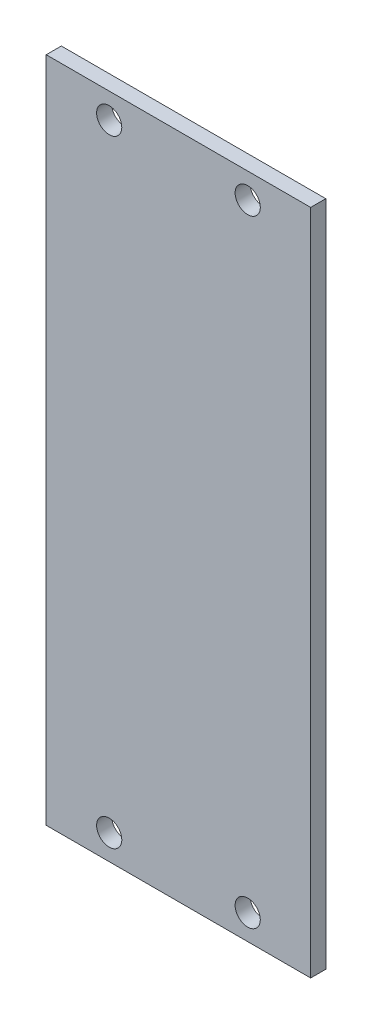
ISO-10303-21;
HEADER;
FILE_DESCRIPTION(('STEP AP214'),'2;1');
FILE_NAME('part.step','',(''),(''),'','','');
FILE_SCHEMA(('AUTOMOTIVE_DESIGN { 1 0 10303 214 1 1 1 1 }'));
ENDSEC;
DATA;
#1=APPLICATION_CONTEXT('core data for automotive mechanical design processes');
#2=APPLICATION_PROTOCOL_DEFINITION('international standard','automotive_design',2000,#1);
#3=PRODUCT_CONTEXT('',#1,'mechanical');
#4=PRODUCT('Part','Part','',(#3));
#5=PRODUCT_RELATED_PRODUCT_CATEGORY('part','',(#4));
#6=PRODUCT_DEFINITION_FORMATION('','',#4);
#7=PRODUCT_DEFINITION_CONTEXT('part definition',#1,'design');
#8=PRODUCT_DEFINITION('design','',#6,#7);
#9=PRODUCT_DEFINITION_SHAPE('','',#8);
#10=(LENGTH_UNIT() NAMED_UNIT(*) SI_UNIT(.MILLI.,.METRE.));
#11=(NAMED_UNIT(*) PLANE_ANGLE_UNIT() SI_UNIT($,.RADIAN.));
#12=(NAMED_UNIT(*) SI_UNIT($,.STERADIAN.) SOLID_ANGLE_UNIT());
#13=UNCERTAINTY_MEASURE_WITH_UNIT(LENGTH_MEASURE(1.E-05),#10,'distance_accuracy_value','');
#14=(GEOMETRIC_REPRESENTATION_CONTEXT(3) GLOBAL_UNCERTAINTY_ASSIGNED_CONTEXT((#13)) GLOBAL_UNIT_ASSIGNED_CONTEXT((#10,
#11,#12)) REPRESENTATION_CONTEXT('',''));
#15=CARTESIAN_POINT('',(0.,0.,0.));
#16=DIRECTION('',(0.,0.,1.));
#17=DIRECTION('',(1.,0.,0.));
#18=AXIS2_PLACEMENT_3D('',#15,#16,#17);
#19=CARTESIAN_POINT('',(0.,0.,1.2));
#20=DIRECTION('',(0.,0.,1.));
#21=DIRECTION('',(1.,0.,0.));
#22=AXIS2_PLACEMENT_3D('',#19,#20,#21);
#23=PLANE('',#22);
#24=CARTESIAN_POINT('',(5.49999999999983,24.5,1.2));
#25=DIRECTION('',(0.,0.,1.));
#26=DIRECTION('',(-1.,0.,0.));
#27=AXIS2_PLACEMENT_3D('',#24,#25,#26);
#28=CIRCLE('',#27,1.);
#29=CARTESIAN_POINT('',(4.49999999999983,24.5,1.2));
#30=VERTEX_POINT('',#29);
#31=EDGE_CURVE('E142',#30,#30,#28,.T.);
#32=ORIENTED_EDGE('',*,*,#31,.F.);
#33=EDGE_LOOP('',(#32));
#34=FACE_BOUND('',#33,.T.);
#35=CARTESIAN_POINT('',(-5.5,24.5,1.2));
#36=DIRECTION('',(0.,0.,1.));
#37=DIRECTION('',(1.,0.,0.));
#38=AXIS2_PLACEMENT_3D('',#35,#36,#37);
#39=CIRCLE('',#38,1.);
#40=CARTESIAN_POINT('',(-4.5,24.5,1.2));
#41=VERTEX_POINT('',#40);
#42=EDGE_CURVE('E112',#41,#41,#39,.T.);
#43=ORIENTED_EDGE('',*,*,#42,.F.);
#44=EDGE_LOOP('',(#43));
#45=FACE_BOUND('',#44,.T.);
#46=DIRECTION('',(0.,-1.,0.));
#47=VECTOR('',#46,1.);
#48=CARTESIAN_POINT('',(-10.5,-26.5,1.2));
#49=LINE('',#48,#47);
#50=CARTESIAN_POINT('',(-10.5,26.5,1.2));
#51=VERTEX_POINT('',#50);
#52=CARTESIAN_POINT('',(-10.5,-26.5,1.2));
#53=VERTEX_POINT('',#52);
#54=EDGE_CURVE('E92',#51,#53,#49,.T.);
#55=ORIENTED_EDGE('',*,*,#54,.T.);
#56=DIRECTION('',(1.,0.,0.));
#57=VECTOR('',#56,1.);
#58=CARTESIAN_POINT('',(10.5,-26.5,1.2));
#59=LINE('',#58,#57);
#60=CARTESIAN_POINT('',(10.5,-26.5,1.2));
#61=VERTEX_POINT('',#60);
#62=EDGE_CURVE('E87',#53,#61,#59,.T.);
#63=ORIENTED_EDGE('',*,*,#62,.T.);
#64=DIRECTION('',(0.,1.,0.));
#65=VECTOR('',#64,1.);
#66=CARTESIAN_POINT('',(10.5,-26.5,1.2));
#67=LINE('',#66,#65);
#68=CARTESIAN_POINT('',(10.5,26.5,1.2));
#69=VERTEX_POINT('',#68);
#70=EDGE_CURVE('E90',#61,#69,#67,.T.);
#71=ORIENTED_EDGE('',*,*,#70,.T.);
#72=DIRECTION('',(-1.,0.,0.));
#73=VECTOR('',#72,1.);
#74=CARTESIAN_POINT('',(10.5,26.5,1.2));
#75=LINE('',#74,#73);
#76=EDGE_CURVE('E57',#69,#51,#75,.T.);
#77=ORIENTED_EDGE('',*,*,#76,.T.);
#78=EDGE_LOOP('',(#55,#63,#71,#77));
#79=FACE_BOUND('',#78,.T.);
#80=CARTESIAN_POINT('',(5.49999999999983,-24.5,1.2));
#81=DIRECTION('',(0.,0.,1.));
#82=DIRECTION('',(1.,0.,0.));
#83=AXIS2_PLACEMENT_3D('',#80,#81,#82);
#84=CIRCLE('',#83,1.);
#85=CARTESIAN_POINT('',(6.49999999999983,-24.5,1.2));
#86=VERTEX_POINT('',#85);
#87=EDGE_CURVE('E134',#86,#86,#84,.T.);
#88=ORIENTED_EDGE('',*,*,#87,.F.);
#89=EDGE_LOOP('',(#88));
#90=FACE_BOUND('',#89,.T.);
#91=CARTESIAN_POINT('',(-5.5,-24.5,1.2));
#92=DIRECTION('',(0.,0.,1.));
#93=DIRECTION('',(-1.,0.,0.));
#94=AXIS2_PLACEMENT_3D('',#91,#92,#93);
#95=CIRCLE('',#94,1.);
#96=CARTESIAN_POINT('',(-6.5,-24.5,1.2));
#97=VERTEX_POINT('',#96);
#98=EDGE_CURVE('E150',#97,#97,#95,.T.);
#99=ORIENTED_EDGE('',*,*,#98,.F.);
#100=EDGE_LOOP('',(#99));
#101=FACE_BOUND('',#100,.T.);
#102=ADVANCED_FACE('F39',(#34,#45,#79,#90,#101),#23,.T.);
#103=CARTESIAN_POINT('',(0.,0.,0.));
#104=DIRECTION('',(0.,0.,1.));
#105=DIRECTION('',(1.,0.,0.));
#106=AXIS2_PLACEMENT_3D('',#103,#104,#105);
#107=PLANE('',#106);
#108=DIRECTION('',(0.,-1.,0.));
#109=VECTOR('',#108,1.);
#110=CARTESIAN_POINT('',(-10.5,-26.5,0.));
#111=LINE('',#110,#109);
#112=CARTESIAN_POINT('',(-10.5,26.5,0.));
#113=VERTEX_POINT('',#112);
#114=CARTESIAN_POINT('',(-10.5,-26.5,0.));
#115=VERTEX_POINT('',#114);
#116=EDGE_CURVE('E108',#113,#115,#111,.T.);
#117=ORIENTED_EDGE('',*,*,#116,.F.);
#118=DIRECTION('',(-1.,0.,0.));
#119=VECTOR('',#118,1.);
#120=CARTESIAN_POINT('',(10.5,26.5,0.));
#121=LINE('',#120,#119);
#122=CARTESIAN_POINT('',(10.5,26.5,0.));
#123=VERTEX_POINT('',#122);
#124=EDGE_CURVE('E80',#123,#113,#121,.T.);
#125=ORIENTED_EDGE('',*,*,#124,.F.);
#126=DIRECTION('',(0.,1.,0.));
#127=VECTOR('',#126,1.);
#128=CARTESIAN_POINT('',(10.5,-26.5,0.));
#129=LINE('',#128,#127);
#130=CARTESIAN_POINT('',(10.5,-26.5,0.));
#131=VERTEX_POINT('',#130);
#132=EDGE_CURVE('E74',#131,#123,#129,.T.);
#133=ORIENTED_EDGE('',*,*,#132,.F.);
#134=DIRECTION('',(1.,0.,0.));
#135=VECTOR('',#134,1.);
#136=CARTESIAN_POINT('',(10.5,-26.5,0.));
#137=LINE('',#136,#135);
#138=EDGE_CURVE('E97',#115,#131,#137,.T.);
#139=ORIENTED_EDGE('',*,*,#138,.F.);
#140=EDGE_LOOP('',(#117,#125,#133,#139));
#141=FACE_BOUND('',#140,.T.);
#142=CARTESIAN_POINT('',(-5.5,24.5,0.));
#143=DIRECTION('',(0.,0.,1.));
#144=DIRECTION('',(1.,0.,0.));
#145=AXIS2_PLACEMENT_3D('',#142,#143,#144);
#146=CIRCLE('',#145,1.);
#147=CARTESIAN_POINT('',(-4.5,24.5,0.));
#148=VERTEX_POINT('',#147);
#149=EDGE_CURVE('E130',#148,#148,#146,.T.);
#150=ORIENTED_EDGE('',*,*,#149,.T.);
#151=EDGE_LOOP('',(#150));
#152=FACE_BOUND('',#151,.T.);
#153=CARTESIAN_POINT('',(5.49999999999983,-24.5,0.));
#154=DIRECTION('',(0.,0.,1.));
#155=DIRECTION('',(1.,0.,0.));
#156=AXIS2_PLACEMENT_3D('',#153,#154,#155);
#157=CIRCLE('',#156,1.);
#158=CARTESIAN_POINT('',(6.49999999999983,-24.5,0.));
#159=VERTEX_POINT('',#158);
#160=EDGE_CURVE('E138',#159,#159,#157,.T.);
#161=ORIENTED_EDGE('',*,*,#160,.T.);
#162=EDGE_LOOP('',(#161));
#163=FACE_BOUND('',#162,.T.);
#164=CARTESIAN_POINT('',(5.49999999999983,24.5,0.));
#165=DIRECTION('',(0.,0.,1.));
#166=DIRECTION('',(-1.,0.,0.));
#167=AXIS2_PLACEMENT_3D('',#164,#165,#166);
#168=CIRCLE('',#167,1.);
#169=CARTESIAN_POINT('',(4.49999999999983,24.5,0.));
#170=VERTEX_POINT('',#169);
#171=EDGE_CURVE('E146',#170,#170,#168,.T.);
#172=ORIENTED_EDGE('',*,*,#171,.T.);
#173=EDGE_LOOP('',(#172));
#174=FACE_BOUND('',#173,.T.);
#175=CARTESIAN_POINT('',(-5.5,-24.5,0.));
#176=DIRECTION('',(0.,0.,1.));
#177=DIRECTION('',(-1.,0.,0.));
#178=AXIS2_PLACEMENT_3D('',#175,#176,#177);
#179=CIRCLE('',#178,1.);
#180=CARTESIAN_POINT('',(-6.5,-24.5,0.));
#181=VERTEX_POINT('',#180);
#182=EDGE_CURVE('E154',#181,#181,#179,.T.);
#183=ORIENTED_EDGE('',*,*,#182,.T.);
#184=EDGE_LOOP('',(#183));
#185=FACE_BOUND('',#184,.T.);
#186=ADVANCED_FACE('F125',(#141,#152,#163,#174,#185),#107,.F.);
#187=CARTESIAN_POINT('',(-10.5,-26.5,1.2));
#188=DIRECTION('',(1.,0.,0.));
#189=DIRECTION('',(0.,0.,-1.));
#190=AXIS2_PLACEMENT_3D('',#187,#188,#189);
#191=PLANE('',#190);
#192=ORIENTED_EDGE('',*,*,#116,.T.);
#193=DIRECTION('',(0.,0.,-1.));
#194=VECTOR('',#193,1.);
#195=CARTESIAN_POINT('',(-10.5,-26.5,1.2));
#196=LINE('',#195,#194);
#197=EDGE_CURVE('E11',#53,#115,#196,.T.);
#198=ORIENTED_EDGE('',*,*,#197,.F.);
#199=ORIENTED_EDGE('',*,*,#54,.F.);
#200=DIRECTION('',(0.,0.,-1.));
#201=VECTOR('',#200,1.);
#202=CARTESIAN_POINT('',(-10.5,26.5,1.2));
#203=LINE('',#202,#201);
#204=EDGE_CURVE('E104',#51,#113,#203,.T.);
#205=ORIENTED_EDGE('',*,*,#204,.T.);
#206=EDGE_LOOP('',(#192,#198,#199,#205));
#207=FACE_BOUND('',#206,.T.);
#208=ADVANCED_FACE('F41',(#207),#191,.F.);
#209=CARTESIAN_POINT('',(10.5,-26.5,1.2));
#210=DIRECTION('',(0.,1.,0.));
#211=DIRECTION('',(-1.,0.,0.));
#212=AXIS2_PLACEMENT_3D('',#209,#210,#211);
#213=PLANE('',#212);
#214=ORIENTED_EDGE('',*,*,#138,.T.);
#215=DIRECTION('',(0.,0.,-1.));
#216=VECTOR('',#215,1.);
#217=CARTESIAN_POINT('',(10.5,-26.5,1.2));
#218=LINE('',#217,#216);
#219=EDGE_CURVE('E49',#61,#131,#218,.T.);
#220=ORIENTED_EDGE('',*,*,#219,.F.);
#221=ORIENTED_EDGE('',*,*,#62,.F.);
#222=ORIENTED_EDGE('',*,*,#197,.T.);
#223=EDGE_LOOP('',(#214,#220,#221,#222));
#224=FACE_BOUND('',#223,.T.);
#225=ADVANCED_FACE('F96',(#224),#213,.F.);
#226=CARTESIAN_POINT('',(10.5,-26.5,1.2));
#227=DIRECTION('',(-1.,0.,0.));
#228=DIRECTION('',(0.,0.,1.));
#229=AXIS2_PLACEMENT_3D('',#226,#227,#228);
#230=PLANE('',#229);
#231=ORIENTED_EDGE('',*,*,#132,.T.);
#232=DIRECTION('',(0.,0.,-1.));
#233=VECTOR('',#232,1.);
#234=CARTESIAN_POINT('',(10.5,26.5,1.2));
#235=LINE('',#234,#233);
#236=EDGE_CURVE('E99',#69,#123,#235,.T.);
#237=ORIENTED_EDGE('',*,*,#236,.F.);
#238=ORIENTED_EDGE('',*,*,#70,.F.);
#239=ORIENTED_EDGE('',*,*,#219,.T.);
#240=EDGE_LOOP('',(#231,#237,#238,#239));
#241=FACE_BOUND('',#240,.T.);
#242=ADVANCED_FACE('F100',(#241),#230,.F.);
#243=CARTESIAN_POINT('',(10.5,26.5,1.2));
#244=DIRECTION('',(0.,-1.,0.));
#245=DIRECTION('',(1.,0.,0.));
#246=AXIS2_PLACEMENT_3D('',#243,#244,#245);
#247=PLANE('',#246);
#248=ORIENTED_EDGE('',*,*,#124,.T.);
#249=ORIENTED_EDGE('',*,*,#204,.F.);
#250=ORIENTED_EDGE('',*,*,#76,.F.);
#251=ORIENTED_EDGE('',*,*,#236,.T.);
#252=EDGE_LOOP('',(#248,#249,#250,#251));
#253=FACE_BOUND('',#252,.T.);
#254=ADVANCED_FACE('F122',(#253),#247,.F.);
#255=CARTESIAN_POINT('',(-5.5,24.5,1.2));
#256=DIRECTION('',(0.,0.,-1.));
#257=DIRECTION('',(-1.,0.,0.));
#258=AXIS2_PLACEMENT_3D('',#255,#256,#257);
#259=CYLINDRICAL_SURFACE('',#258,1.);
#260=ORIENTED_EDGE('',*,*,#42,.T.);
#261=EDGE_LOOP('',(#260));
#262=FACE_BOUND('',#261,.T.);
#263=ORIENTED_EDGE('',*,*,#149,.F.);
#264=EDGE_LOOP('',(#263));
#265=FACE_BOUND('',#264,.T.);
#266=ADVANCED_FACE('F175',(#262,#265),#259,.F.);
#267=CARTESIAN_POINT('',(5.49999999999983,-24.5,1.2));
#268=DIRECTION('',(0.,0.,-1.));
#269=DIRECTION('',(-1.,0.,0.));
#270=AXIS2_PLACEMENT_3D('',#267,#268,#269);
#271=CYLINDRICAL_SURFACE('',#270,1.);
#272=ORIENTED_EDGE('',*,*,#87,.T.);
#273=EDGE_LOOP('',(#272));
#274=FACE_BOUND('',#273,.T.);
#275=ORIENTED_EDGE('',*,*,#160,.F.);
#276=EDGE_LOOP('',(#275));
#277=FACE_BOUND('',#276,.T.);
#278=ADVANCED_FACE('F221',(#274,#277),#271,.F.);
#279=CARTESIAN_POINT('',(5.49999999999983,24.5,1.2));
#280=DIRECTION('',(0.,0.,-1.));
#281=DIRECTION('',(-1.,0.,0.));
#282=AXIS2_PLACEMENT_3D('',#279,#280,#281);
#283=CYLINDRICAL_SURFACE('',#282,1.);
#284=ORIENTED_EDGE('',*,*,#31,.T.);
#285=EDGE_LOOP('',(#284));
#286=FACE_BOUND('',#285,.T.);
#287=ORIENTED_EDGE('',*,*,#171,.F.);
#288=EDGE_LOOP('',(#287));
#289=FACE_BOUND('',#288,.T.);
#290=ADVANCED_FACE('F229',(#286,#289),#283,.F.);
#291=CARTESIAN_POINT('',(-5.5,-24.5,1.2));
#292=DIRECTION('',(0.,0.,-1.));
#293=DIRECTION('',(-1.,0.,0.));
#294=AXIS2_PLACEMENT_3D('',#291,#292,#293);
#295=CYLINDRICAL_SURFACE('',#294,1.);
#296=ORIENTED_EDGE('',*,*,#98,.T.);
#297=EDGE_LOOP('',(#296));
#298=FACE_BOUND('',#297,.T.);
#299=ORIENTED_EDGE('',*,*,#182,.F.);
#300=EDGE_LOOP('',(#299));
#301=FACE_BOUND('',#300,.T.);
#302=ADVANCED_FACE('F162',(#298,#301),#295,.F.);
#303=CLOSED_SHELL('',(#102,#186,#208,#225,#242,#254,#266,#278,#290,#302));
#304=MANIFOLD_SOLID_BREP('B2',#303);
#305=ADVANCED_BREP_SHAPE_REPRESENTATION('',(#18,#304),#14);
#306=SHAPE_DEFINITION_REPRESENTATION(#9,#305);
ENDSEC;
END-ISO-10303-21;
